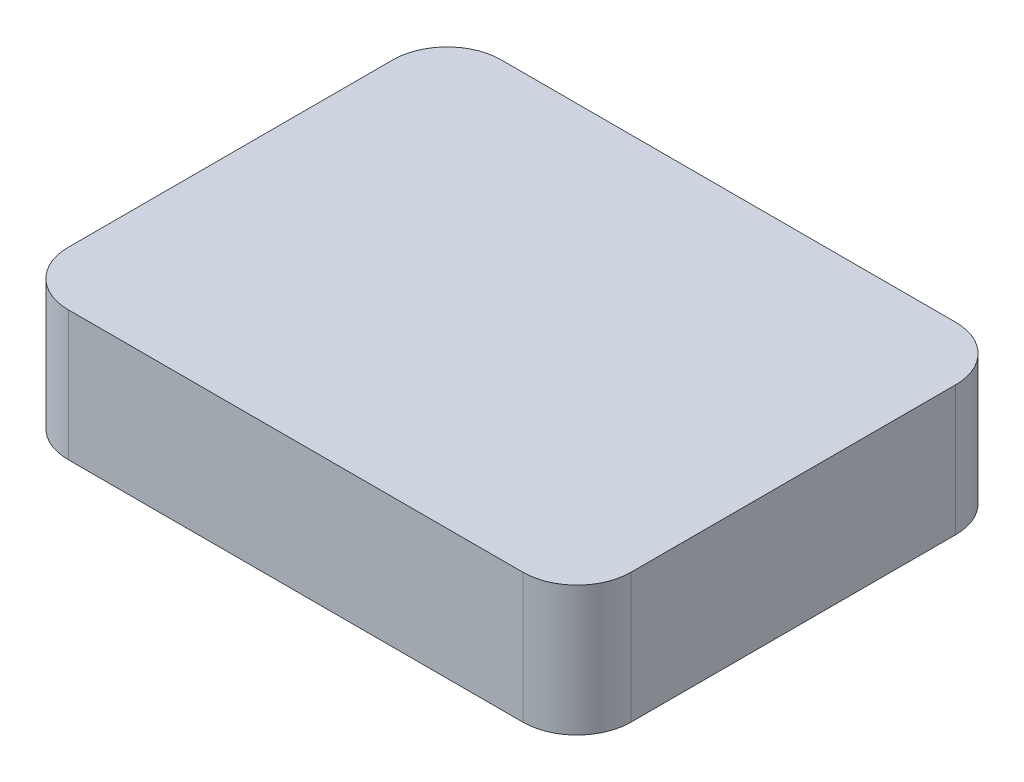
ISO-10303-21;
HEADER;
FILE_DESCRIPTION(('STEP AP214'),'2;1');
FILE_NAME('part.step','',(''),(''),'','','');
FILE_SCHEMA(('AUTOMOTIVE_DESIGN { 1 0 10303 214 1 1 1 1 }'));
ENDSEC;
DATA;
#1=APPLICATION_CONTEXT('core data for automotive mechanical design processes');
#2=APPLICATION_PROTOCOL_DEFINITION('international standard','automotive_design',2000,#1);
#3=PRODUCT_CONTEXT('',#1,'mechanical');
#4=PRODUCT('Part','Part','',(#3));
#5=PRODUCT_RELATED_PRODUCT_CATEGORY('part','',(#4));
#6=PRODUCT_DEFINITION_FORMATION('','',#4);
#7=PRODUCT_DEFINITION_CONTEXT('part definition',#1,'design');
#8=PRODUCT_DEFINITION('design','',#6,#7);
#9=PRODUCT_DEFINITION_SHAPE('','',#8);
#10=(LENGTH_UNIT() NAMED_UNIT(*) SI_UNIT(.MILLI.,.METRE.));
#11=(NAMED_UNIT(*) PLANE_ANGLE_UNIT() SI_UNIT($,.RADIAN.));
#12=(NAMED_UNIT(*) SI_UNIT($,.STERADIAN.) SOLID_ANGLE_UNIT());
#13=UNCERTAINTY_MEASURE_WITH_UNIT(LENGTH_MEASURE(1.E-05),#10,'distance_accuracy_value','');
#14=(GEOMETRIC_REPRESENTATION_CONTEXT(3) GLOBAL_UNCERTAINTY_ASSIGNED_CONTEXT((#13)) GLOBAL_UNIT_ASSIGNED_CONTEXT((#10,
#11,#12)) REPRESENTATION_CONTEXT('',''));
#15=CARTESIAN_POINT('',(0.,0.,0.));
#16=DIRECTION('',(0.,0.,1.));
#17=DIRECTION('',(1.,0.,0.));
#18=AXIS2_PLACEMENT_3D('',#15,#16,#17);
#19=CARTESIAN_POINT('',(-26.,12.,20.));
#20=DIRECTION('',(1.,0.,0.));
#21=DIRECTION('',(0.,0.,-1.));
#22=AXIS2_PLACEMENT_3D('',#19,#20,#21);
#23=PLANE('',#22);
#24=DIRECTION('',(0.,0.,1.));
#25=VECTOR('',#24,1.);
#26=CARTESIAN_POINT('',(-26.,12.,20.));
#27=LINE('',#26,#25);
#28=CARTESIAN_POINT('',(-26.,12.,-15.));
#29=VERTEX_POINT('',#28);
#30=CARTESIAN_POINT('',(-26.,12.,15.));
#31=VERTEX_POINT('',#30);
#32=EDGE_CURVE('E126',#29,#31,#27,.T.);
#33=ORIENTED_EDGE('',*,*,#32,.F.);
#34=DIRECTION('',(0.,-1.,0.));
#35=VECTOR('',#34,1.);
#36=CARTESIAN_POINT('',(-26.,12.,-15.));
#37=LINE('',#36,#35);
#38=CARTESIAN_POINT('',(-26.,0.,-15.));
#39=VERTEX_POINT('',#38);
#40=EDGE_CURVE('E110',#29,#39,#37,.T.);
#41=ORIENTED_EDGE('',*,*,#40,.T.);
#42=DIRECTION('',(0.,0.,1.));
#43=VECTOR('',#42,1.);
#44=CARTESIAN_POINT('',(-26.,0.,20.));
#45=LINE('',#44,#43);
#46=CARTESIAN_POINT('',(-26.,0.,15.));
#47=VERTEX_POINT('',#46);
#48=EDGE_CURVE('E123',#39,#47,#45,.T.);
#49=ORIENTED_EDGE('',*,*,#48,.T.);
#50=DIRECTION('',(0.,-1.,0.));
#51=VECTOR('',#50,1.);
#52=CARTESIAN_POINT('',(-26.,12.,15.));
#53=LINE('',#52,#51);
#54=EDGE_CURVE('E129',#47,#31,#53,.F.);
#55=ORIENTED_EDGE('',*,*,#54,.T.);
#56=EDGE_LOOP('',(#33,#41,#49,#55));
#57=FACE_BOUND('',#56,.T.);
#58=ADVANCED_FACE('F39',(#57),#23,.F.);
#59=CARTESIAN_POINT('',(26.,12.,20.));
#60=DIRECTION('',(0.,0.,-1.));
#61=DIRECTION('',(-1.,0.,0.));
#62=AXIS2_PLACEMENT_3D('',#59,#60,#61);
#63=PLANE('',#62);
#64=DIRECTION('',(1.,0.,0.));
#65=VECTOR('',#64,1.);
#66=CARTESIAN_POINT('',(26.,0.,20.));
#67=LINE('',#66,#65);
#68=CARTESIAN_POINT('',(-21.,0.,20.));
#69=VERTEX_POINT('',#68);
#70=CARTESIAN_POINT('',(21.,0.,20.));
#71=VERTEX_POINT('',#70);
#72=EDGE_CURVE('E134',#69,#71,#67,.T.);
#73=ORIENTED_EDGE('',*,*,#72,.T.);
#74=DIRECTION('',(0.,-1.,0.));
#75=VECTOR('',#74,1.);
#76=CARTESIAN_POINT('',(21.,12.,20.));
#77=LINE('',#76,#75);
#78=CARTESIAN_POINT('',(21.,12.,20.));
#79=VERTEX_POINT('',#78);
#80=EDGE_CURVE('E11',#71,#79,#77,.F.);
#81=ORIENTED_EDGE('',*,*,#80,.T.);
#82=DIRECTION('',(1.,0.,0.));
#83=VECTOR('',#82,1.);
#84=CARTESIAN_POINT('',(26.,12.,20.));
#85=LINE('',#84,#83);
#86=CARTESIAN_POINT('',(-21.,12.,20.));
#87=VERTEX_POINT('',#86);
#88=EDGE_CURVE('E186',#87,#79,#85,.T.);
#89=ORIENTED_EDGE('',*,*,#88,.F.);
#90=DIRECTION('',(0.,-1.,0.));
#91=VECTOR('',#90,1.);
#92=CARTESIAN_POINT('',(-21.,12.,20.));
#93=LINE('',#92,#91);
#94=EDGE_CURVE('E48',#87,#69,#93,.T.);
#95=ORIENTED_EDGE('',*,*,#94,.T.);
#96=EDGE_LOOP('',(#73,#81,#89,#95));
#97=FACE_BOUND('',#96,.T.);
#98=ADVANCED_FACE('F184',(#97),#63,.F.);
#99=CARTESIAN_POINT('',(26.,12.,20.));
#100=DIRECTION('',(-1.,0.,0.));
#101=DIRECTION('',(0.,0.,1.));
#102=AXIS2_PLACEMENT_3D('',#99,#100,#101);
#103=PLANE('',#102);
#104=DIRECTION('',(0.,0.,-1.));
#105=VECTOR('',#104,1.);
#106=CARTESIAN_POINT('',(26.,0.,20.));
#107=LINE('',#106,#105);
#108=CARTESIAN_POINT('',(26.,0.,15.));
#109=VERTEX_POINT('',#108);
#110=CARTESIAN_POINT('',(26.,0.,-15.));
#111=VERTEX_POINT('',#110);
#112=EDGE_CURVE('E138',#109,#111,#107,.T.);
#113=ORIENTED_EDGE('',*,*,#112,.T.);
#114=DIRECTION('',(0.,-1.,0.));
#115=VECTOR('',#114,1.);
#116=CARTESIAN_POINT('',(26.,12.,-15.));
#117=LINE('',#116,#115);
#118=CARTESIAN_POINT('',(26.,12.,-15.));
#119=VERTEX_POINT('',#118);
#120=EDGE_CURVE('E55',#111,#119,#117,.F.);
#121=ORIENTED_EDGE('',*,*,#120,.T.);
#122=DIRECTION('',(0.,0.,-1.));
#123=VECTOR('',#122,1.);
#124=CARTESIAN_POINT('',(26.,12.,20.));
#125=LINE('',#124,#123);
#126=CARTESIAN_POINT('',(26.,12.,15.));
#127=VERTEX_POINT('',#126);
#128=EDGE_CURVE('E194',#127,#119,#125,.T.);
#129=ORIENTED_EDGE('',*,*,#128,.F.);
#130=DIRECTION('',(0.,-1.,0.));
#131=VECTOR('',#130,1.);
#132=CARTESIAN_POINT('',(26.,12.,15.));
#133=LINE('',#132,#131);
#134=EDGE_CURVE('E174',#127,#109,#133,.T.);
#135=ORIENTED_EDGE('',*,*,#134,.T.);
#136=EDGE_LOOP('',(#113,#121,#129,#135));
#137=FACE_BOUND('',#136,.T.);
#138=ADVANCED_FACE('F193',(#137),#103,.F.);
#139=CARTESIAN_POINT('',(26.,12.,-20.));
#140=DIRECTION('',(0.,0.,1.));
#141=DIRECTION('',(1.,0.,0.));
#142=AXIS2_PLACEMENT_3D('',#139,#140,#141);
#143=PLANE('',#142);
#144=DIRECTION('',(-1.,0.,0.));
#145=VECTOR('',#144,1.);
#146=CARTESIAN_POINT('',(26.,0.,-20.));
#147=LINE('',#146,#145);
#148=CARTESIAN_POINT('',(21.,0.,-20.));
#149=VERTEX_POINT('',#148);
#150=CARTESIAN_POINT('',(-21.,0.,-20.));
#151=VERTEX_POINT('',#150);
#152=EDGE_CURVE('E146',#149,#151,#147,.T.);
#153=ORIENTED_EDGE('',*,*,#152,.T.);
#154=DIRECTION('',(0.,-1.,0.));
#155=VECTOR('',#154,1.);
#156=CARTESIAN_POINT('',(-21.,12.,-20.));
#157=LINE('',#156,#155);
#158=CARTESIAN_POINT('',(-21.,12.,-20.));
#159=VERTEX_POINT('',#158);
#160=EDGE_CURVE('E111',#151,#159,#157,.F.);
#161=ORIENTED_EDGE('',*,*,#160,.T.);
#162=DIRECTION('',(-1.,0.,0.));
#163=VECTOR('',#162,1.);
#164=CARTESIAN_POINT('',(26.,12.,-20.));
#165=LINE('',#164,#163);
#166=CARTESIAN_POINT('',(21.,12.,-20.));
#167=VERTEX_POINT('',#166);
#168=EDGE_CURVE('E141',#167,#159,#165,.T.);
#169=ORIENTED_EDGE('',*,*,#168,.F.);
#170=DIRECTION('',(0.,-1.,0.));
#171=VECTOR('',#170,1.);
#172=CARTESIAN_POINT('',(21.,12.,-20.));
#173=LINE('',#172,#171);
#174=EDGE_CURVE('E117',#167,#149,#173,.T.);
#175=ORIENTED_EDGE('',*,*,#174,.T.);
#176=EDGE_LOOP('',(#153,#161,#169,#175));
#177=FACE_BOUND('',#176,.T.);
#178=ADVANCED_FACE('F226',(#177),#143,.F.);
#179=CARTESIAN_POINT('',(0.,12.,0.));
#180=DIRECTION('',(0.,1.,0.));
#181=DIRECTION('',(0.,0.,1.));
#182=AXIS2_PLACEMENT_3D('',#179,#180,#181);
#183=PLANE('',#182);
#184=ORIENTED_EDGE('',*,*,#168,.T.);
#185=CARTESIAN_POINT('',(-21.,12.,-15.));
#186=DIRECTION('',(0.,1.,0.));
#187=DIRECTION('',(0.,0.,1.));
#188=AXIS2_PLACEMENT_3D('',#185,#186,#187);
#189=CIRCLE('',#188,5.);
#190=EDGE_CURVE('E171',#159,#29,#189,.T.);
#191=ORIENTED_EDGE('',*,*,#190,.T.);
#192=ORIENTED_EDGE('',*,*,#32,.T.);
#193=CARTESIAN_POINT('',(-21.,12.,15.));
#194=DIRECTION('',(0.,1.,0.));
#195=DIRECTION('',(0.,0.,1.));
#196=AXIS2_PLACEMENT_3D('',#193,#194,#195);
#197=CIRCLE('',#196,5.);
#198=EDGE_CURVE('E163',#31,#87,#197,.T.);
#199=ORIENTED_EDGE('',*,*,#198,.T.);
#200=ORIENTED_EDGE('',*,*,#88,.T.);
#201=CARTESIAN_POINT('',(21.,12.,15.));
#202=DIRECTION('',(0.,1.,0.));
#203=DIRECTION('',(0.,0.,1.));
#204=AXIS2_PLACEMENT_3D('',#201,#202,#203);
#205=CIRCLE('',#204,5.);
#206=EDGE_CURVE('E62',#79,#127,#205,.T.);
#207=ORIENTED_EDGE('',*,*,#206,.T.);
#208=ORIENTED_EDGE('',*,*,#128,.T.);
#209=CARTESIAN_POINT('',(21.,12.,-15.));
#210=DIRECTION('',(0.,1.,0.));
#211=DIRECTION('',(0.,0.,1.));
#212=AXIS2_PLACEMENT_3D('',#209,#210,#211);
#213=CIRCLE('',#212,5.);
#214=EDGE_CURVE('E168',#119,#167,#213,.T.);
#215=ORIENTED_EDGE('',*,*,#214,.T.);
#216=EDGE_LOOP('',(#184,#191,#192,#199,#200,#207,#208,#215));
#217=FACE_BOUND('',#216,.T.);
#218=ADVANCED_FACE('F203',(#217),#183,.T.);
#219=CARTESIAN_POINT('',(0.,0.,0.));
#220=DIRECTION('',(0.,1.,0.));
#221=DIRECTION('',(0.,0.,1.));
#222=AXIS2_PLACEMENT_3D('',#219,#220,#221);
#223=PLANE('',#222);
#224=ORIENTED_EDGE('',*,*,#48,.F.);
#225=CARTESIAN_POINT('',(-21.,0.,-15.));
#226=DIRECTION('',(0.,1.,0.));
#227=DIRECTION('',(0.,0.,1.));
#228=AXIS2_PLACEMENT_3D('',#225,#226,#227);
#229=CIRCLE('',#228,5.);
#230=EDGE_CURVE('E106',#39,#151,#229,.F.);
#231=ORIENTED_EDGE('',*,*,#230,.T.);
#232=ORIENTED_EDGE('',*,*,#152,.F.);
#233=CARTESIAN_POINT('',(21.,0.,-15.));
#234=DIRECTION('',(0.,1.,0.));
#235=DIRECTION('',(0.,0.,1.));
#236=AXIS2_PLACEMENT_3D('',#233,#234,#235);
#237=CIRCLE('',#236,5.);
#238=EDGE_CURVE('E118',#149,#111,#237,.F.);
#239=ORIENTED_EDGE('',*,*,#238,.T.);
#240=ORIENTED_EDGE('',*,*,#112,.F.);
#241=CARTESIAN_POINT('',(21.,0.,15.));
#242=DIRECTION('',(0.,1.,0.));
#243=DIRECTION('',(0.,0.,1.));
#244=AXIS2_PLACEMENT_3D('',#241,#242,#243);
#245=CIRCLE('',#244,5.);
#246=EDGE_CURVE('E153',#109,#71,#245,.F.);
#247=ORIENTED_EDGE('',*,*,#246,.T.);
#248=ORIENTED_EDGE('',*,*,#72,.F.);
#249=CARTESIAN_POINT('',(-21.,0.,15.));
#250=DIRECTION('',(0.,1.,0.));
#251=DIRECTION('',(0.,0.,1.));
#252=AXIS2_PLACEMENT_3D('',#249,#250,#251);
#253=CIRCLE('',#252,5.);
#254=EDGE_CURVE('E128',#69,#47,#253,.F.);
#255=ORIENTED_EDGE('',*,*,#254,.T.);
#256=EDGE_LOOP('',(#224,#231,#232,#239,#240,#247,#248,#255));
#257=FACE_BOUND('',#256,.T.);
#258=ADVANCED_FACE('F131',(#257),#223,.F.);
#259=CARTESIAN_POINT('',(-21.,12.,-15.));
#260=DIRECTION('',(0.,-1.,0.));
#261=DIRECTION('',(0.,0.,-1.));
#262=AXIS2_PLACEMENT_3D('',#259,#260,#261);
#263=CYLINDRICAL_SURFACE('',#262,5.);
#264=ORIENTED_EDGE('',*,*,#190,.F.);
#265=ORIENTED_EDGE('',*,*,#160,.F.);
#266=ORIENTED_EDGE('',*,*,#230,.F.);
#267=ORIENTED_EDGE('',*,*,#40,.F.);
#268=EDGE_LOOP('',(#264,#265,#266,#267));
#269=FACE_BOUND('',#268,.T.);
#270=ADVANCED_FACE('F109',(#269),#263,.T.);
#271=CARTESIAN_POINT('',(21.,12.,-15.));
#272=DIRECTION('',(0.,-1.,0.));
#273=DIRECTION('',(0.,0.,-1.));
#274=AXIS2_PLACEMENT_3D('',#271,#272,#273);
#275=CYLINDRICAL_SURFACE('',#274,5.);
#276=ORIENTED_EDGE('',*,*,#214,.F.);
#277=ORIENTED_EDGE('',*,*,#120,.F.);
#278=ORIENTED_EDGE('',*,*,#238,.F.);
#279=ORIENTED_EDGE('',*,*,#174,.F.);
#280=EDGE_LOOP('',(#276,#277,#278,#279));
#281=FACE_BOUND('',#280,.T.);
#282=ADVANCED_FACE('F208',(#281),#275,.T.);
#283=CARTESIAN_POINT('',(21.,12.,15.));
#284=DIRECTION('',(0.,-1.,0.));
#285=DIRECTION('',(0.,0.,-1.));
#286=AXIS2_PLACEMENT_3D('',#283,#284,#285);
#287=CYLINDRICAL_SURFACE('',#286,5.);
#288=ORIENTED_EDGE('',*,*,#206,.F.);
#289=ORIENTED_EDGE('',*,*,#80,.F.);
#290=ORIENTED_EDGE('',*,*,#246,.F.);
#291=ORIENTED_EDGE('',*,*,#134,.F.);
#292=EDGE_LOOP('',(#288,#289,#290,#291));
#293=FACE_BOUND('',#292,.T.);
#294=ADVANCED_FACE('F192',(#293),#287,.T.);
#295=CARTESIAN_POINT('',(-21.,12.,15.));
#296=DIRECTION('',(0.,-1.,0.));
#297=DIRECTION('',(0.,0.,-1.));
#298=AXIS2_PLACEMENT_3D('',#295,#296,#297);
#299=CYLINDRICAL_SURFACE('',#298,5.);
#300=ORIENTED_EDGE('',*,*,#198,.F.);
#301=ORIENTED_EDGE('',*,*,#54,.F.);
#302=ORIENTED_EDGE('',*,*,#254,.F.);
#303=ORIENTED_EDGE('',*,*,#94,.F.);
#304=EDGE_LOOP('',(#300,#301,#302,#303));
#305=FACE_BOUND('',#304,.T.);
#306=ADVANCED_FACE('F41',(#305),#299,.T.);
#307=CLOSED_SHELL('',(#58,#98,#138,#178,#218,#258,#270,#282,#294,#306));
#308=MANIFOLD_SOLID_BREP('B2',#307);
#309=ADVANCED_BREP_SHAPE_REPRESENTATION('',(#18,#308),#14);
#310=SHAPE_DEFINITION_REPRESENTATION(#9,#309);
ENDSEC;
END-ISO-10303-21;
